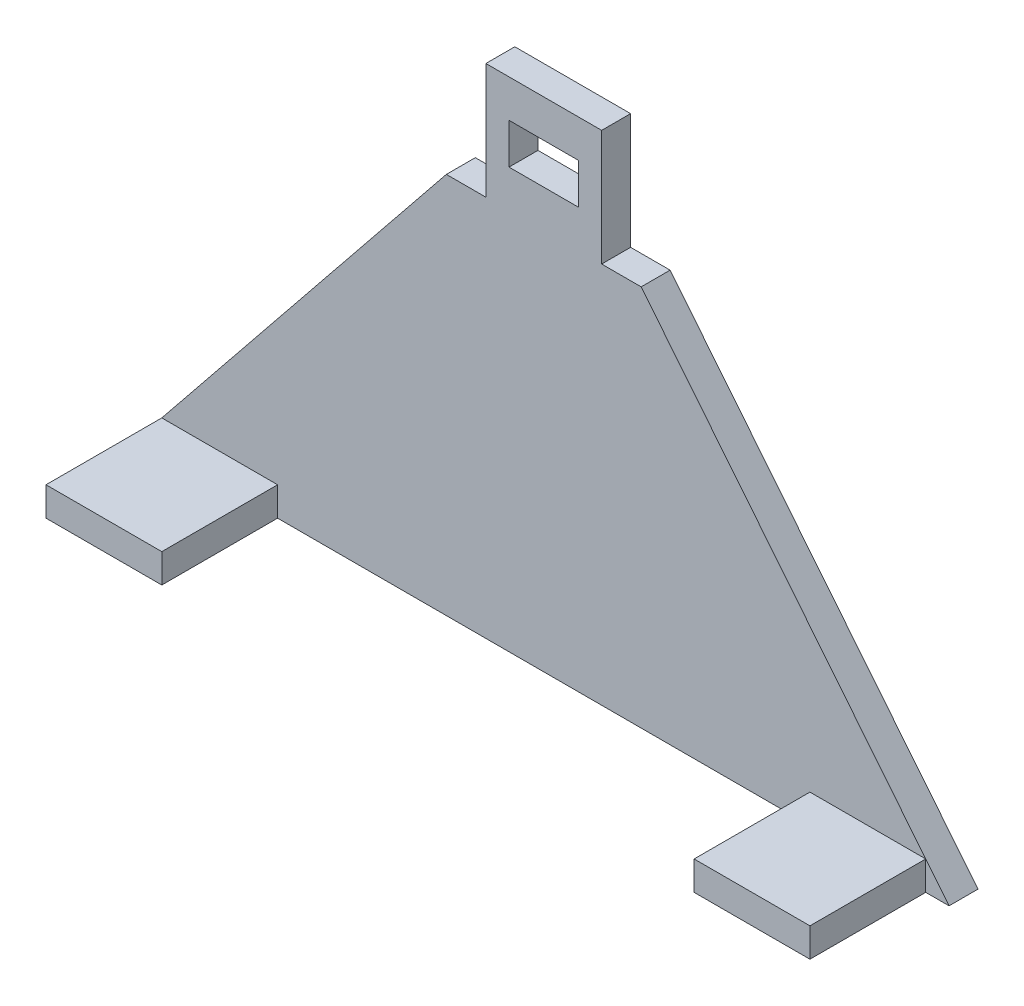
ISO-10303-21;
HEADER;
FILE_DESCRIPTION(('STEP AP214'),'2;1');
FILE_NAME('part.step','',(''),(''),'','','');
FILE_SCHEMA(('AUTOMOTIVE_DESIGN { 1 0 10303 214 1 1 1 1 }'));
ENDSEC;
DATA;
#1=APPLICATION_CONTEXT('core data for automotive mechanical design processes');
#2=APPLICATION_PROTOCOL_DEFINITION('international standard','automotive_design',2000,#1);
#3=PRODUCT_CONTEXT('',#1,'mechanical');
#4=PRODUCT('Part','Part','',(#3));
#5=PRODUCT_RELATED_PRODUCT_CATEGORY('part','',(#4));
#6=PRODUCT_DEFINITION_FORMATION('','',#4);
#7=PRODUCT_DEFINITION_CONTEXT('part definition',#1,'design');
#8=PRODUCT_DEFINITION('design','',#6,#7);
#9=PRODUCT_DEFINITION_SHAPE('','',#8);
#10=(LENGTH_UNIT() NAMED_UNIT(*) SI_UNIT(.MILLI.,.METRE.));
#11=(NAMED_UNIT(*) PLANE_ANGLE_UNIT() SI_UNIT($,.RADIAN.));
#12=(NAMED_UNIT(*) SI_UNIT($,.STERADIAN.) SOLID_ANGLE_UNIT());
#13=UNCERTAINTY_MEASURE_WITH_UNIT(LENGTH_MEASURE(1.E-05),#10,'distance_accuracy_value','');
#14=(GEOMETRIC_REPRESENTATION_CONTEXT(3) GLOBAL_UNCERTAINTY_ASSIGNED_CONTEXT((#13)) GLOBAL_UNIT_ASSIGNED_CONTEXT((#10,
#11,#12)) REPRESENTATION_CONTEXT('',''));
#15=CARTESIAN_POINT('',(0.,0.,0.));
#16=DIRECTION('',(0.,0.,1.));
#17=DIRECTION('',(1.,0.,0.));
#18=AXIS2_PLACEMENT_3D('',#15,#16,#17);
#19=CARTESIAN_POINT('',(0.,0.,0.));
#20=DIRECTION('',(0.,0.,-1.));
#21=DIRECTION('',(-1.,0.,0.));
#22=AXIS2_PLACEMENT_3D('',#19,#20,#21);
#23=PLANE('',#22);
#24=DIRECTION('',(-0.627396072560664,0.778700307008707,0.));
#25=VECTOR('',#24,1.);
#26=CARTESIAN_POINT('',(35.,0.,0.));
#27=LINE('',#26,#25);
#28=CARTESIAN_POINT('',(35.,0.,0.));
#29=VERTEX_POINT('',#28);
#30=CARTESIAN_POINT('',(32.9857588763168,2.5,0.));
#31=VERTEX_POINT('',#30);
#32=EDGE_CURVE('E279',#29,#31,#27,.T.);
#33=ORIENTED_EDGE('',*,*,#32,.T.);
#34=DIRECTION('',(0.,-1.,0.));
#35=VECTOR('',#34,1.);
#36=CARTESIAN_POINT('',(32.9857588763168,2.5,0.));
#37=LINE('',#36,#35);
#38=CARTESIAN_POINT('',(32.9857588763168,0.,0.));
#39=VERTEX_POINT('',#38);
#40=EDGE_CURVE('E183',#31,#39,#37,.T.);
#41=ORIENTED_EDGE('',*,*,#40,.T.);
#42=DIRECTION('',(1.,0.,0.));
#43=VECTOR('',#42,1.);
#44=CARTESIAN_POINT('',(-35.,0.,0.));
#45=LINE('',#44,#43);
#46=EDGE_CURVE('E318',#39,#29,#45,.T.);
#47=ORIENTED_EDGE('',*,*,#46,.T.);
#48=EDGE_LOOP('',(#33,#41,#47));
#49=FACE_BOUND('',#48,.T.);
#50=ADVANCED_FACE('F37',(#49),#23,.F.);
#51=DIRECTION('',(0.,-1.,0.));
#52=VECTOR('',#51,1.);
#53=CARTESIAN_POINT('',(-32.9857588763168,2.5,0.));
#54=LINE('',#53,#52);
#55=CARTESIAN_POINT('',(-32.9857588763168,2.5,0.));
#56=VERTEX_POINT('',#55);
#57=CARTESIAN_POINT('',(-32.9857588763168,0.,0.));
#58=VERTEX_POINT('',#57);
#59=EDGE_CURVE('E186',#56,#58,#54,.T.);
#60=ORIENTED_EDGE('',*,*,#59,.F.);
#61=DIRECTION('',(-0.627396072560664,-0.778700307008707,0.));
#62=VECTOR('',#61,1.);
#63=CARTESIAN_POINT('',(-8.41201716738196,33.,0.));
#64=LINE('',#63,#62);
#65=CARTESIAN_POINT('',(-35.,0.,0.));
#66=VERTEX_POINT('',#65);
#67=EDGE_CURVE('E314',#56,#66,#64,.T.);
#68=ORIENTED_EDGE('',*,*,#67,.T.);
#69=EDGE_CURVE('E319',#66,#58,#45,.T.);
#70=ORIENTED_EDGE('',*,*,#69,.T.);
#71=EDGE_LOOP('',(#60,#68,#70));
#72=FACE_BOUND('',#71,.T.);
#73=ADVANCED_FACE('F389',(#72),#23,.F.);
#74=DIRECTION('',(1.,0.,0.));
#75=VECTOR('',#74,1.);
#76=CARTESIAN_POINT('',(-3.,36.25,0.));
#77=LINE('',#76,#75);
#78=CARTESIAN_POINT('',(-3.,36.25,0.));
#79=VERTEX_POINT('',#78);
#80=CARTESIAN_POINT('',(3.,36.25,0.));
#81=VERTEX_POINT('',#80);
#82=EDGE_CURVE('E258',#79,#81,#77,.T.);
#83=ORIENTED_EDGE('',*,*,#82,.F.);
#84=DIRECTION('',(0.,-1.,0.));
#85=VECTOR('',#84,1.);
#86=CARTESIAN_POINT('',(-3.,39.75,0.));
#87=LINE('',#86,#85);
#88=CARTESIAN_POINT('',(-3.,39.75,0.));
#89=VERTEX_POINT('',#88);
#90=EDGE_CURVE('E242',#89,#79,#87,.T.);
#91=ORIENTED_EDGE('',*,*,#90,.F.);
#92=DIRECTION('',(-1.,0.,0.));
#93=VECTOR('',#92,1.);
#94=CARTESIAN_POINT('',(-3.,39.75,0.));
#95=LINE('',#94,#93);
#96=CARTESIAN_POINT('',(3.,39.75,0.));
#97=VERTEX_POINT('',#96);
#98=EDGE_CURVE('E247',#97,#89,#95,.T.);
#99=ORIENTED_EDGE('',*,*,#98,.F.);
#100=DIRECTION('',(0.,1.,0.));
#101=VECTOR('',#100,1.);
#102=CARTESIAN_POINT('',(3.,39.75,0.));
#103=LINE('',#102,#101);
#104=EDGE_CURVE('E261',#81,#97,#103,.T.);
#105=ORIENTED_EDGE('',*,*,#104,.F.);
#106=EDGE_LOOP('',(#83,#91,#99,#105));
#107=FACE_BOUND('',#106,.T.);
#108=DIRECTION('',(0.,1.,0.));
#109=VECTOR('',#108,1.);
#110=CARTESIAN_POINT('',(22.9857588763168,2.5,0.));
#111=LINE('',#110,#109);
#112=CARTESIAN_POINT('',(22.9857588763168,0.,0.));
#113=VERTEX_POINT('',#112);
#114=CARTESIAN_POINT('',(22.9857588763168,2.5,0.));
#115=VERTEX_POINT('',#114);
#116=EDGE_CURVE('E54',#113,#115,#111,.T.);
#117=ORIENTED_EDGE('',*,*,#116,.T.);
#118=DIRECTION('',(1.,0.,0.));
#119=VECTOR('',#118,1.);
#120=CARTESIAN_POINT('',(32.9857588763168,2.5,0.));
#121=LINE('',#120,#119);
#122=EDGE_CURVE('E59',#115,#31,#121,.T.);
#123=ORIENTED_EDGE('',*,*,#122,.T.);
#124=CARTESIAN_POINT('',(8.41201716738196,33.,0.));
#125=VERTEX_POINT('',#124);
#126=EDGE_CURVE('E321',#31,#125,#27,.T.);
#127=ORIENTED_EDGE('',*,*,#126,.T.);
#128=DIRECTION('',(-1.,0.,0.));
#129=VECTOR('',#128,1.);
#130=CARTESIAN_POINT('',(8.41201716738196,33.,0.));
#131=LINE('',#130,#129);
#132=CARTESIAN_POINT('',(5.,33.,0.));
#133=VERTEX_POINT('',#132);
#134=EDGE_CURVE('E268',#125,#133,#131,.T.);
#135=ORIENTED_EDGE('',*,*,#134,.T.);
#136=DIRECTION('',(0.,1.,0.));
#137=VECTOR('',#136,1.);
#138=CARTESIAN_POINT('',(5.,33.,0.));
#139=LINE('',#138,#137);
#140=CARTESIAN_POINT('',(5.,43.,0.));
#141=VERTEX_POINT('',#140);
#142=EDGE_CURVE('E302',#133,#141,#139,.T.);
#143=ORIENTED_EDGE('',*,*,#142,.T.);
#144=DIRECTION('',(-1.,0.,0.));
#145=VECTOR('',#144,1.);
#146=CARTESIAN_POINT('',(5.,43.,0.));
#147=LINE('',#146,#145);
#148=CARTESIAN_POINT('',(-5.,43.,0.));
#149=VERTEX_POINT('',#148);
#150=EDGE_CURVE('E305',#141,#149,#147,.T.);
#151=ORIENTED_EDGE('',*,*,#150,.T.);
#152=DIRECTION('',(0.,-1.,0.));
#153=VECTOR('',#152,1.);
#154=CARTESIAN_POINT('',(-5.,43.,0.));
#155=LINE('',#154,#153);
#156=CARTESIAN_POINT('',(-5.,33.,0.));
#157=VERTEX_POINT('',#156);
#158=EDGE_CURVE('E308',#149,#157,#155,.T.);
#159=ORIENTED_EDGE('',*,*,#158,.T.);
#160=DIRECTION('',(-1.,0.,0.));
#161=VECTOR('',#160,1.);
#162=CARTESIAN_POINT('',(-5.,33.,0.));
#163=LINE('',#162,#161);
#164=CARTESIAN_POINT('',(-8.41201716738196,33.,0.));
#165=VERTEX_POINT('',#164);
#166=EDGE_CURVE('E311',#157,#165,#163,.T.);
#167=ORIENTED_EDGE('',*,*,#166,.T.);
#168=EDGE_CURVE('E315',#165,#56,#64,.T.);
#169=ORIENTED_EDGE('',*,*,#168,.T.);
#170=DIRECTION('',(-1.,0.,0.));
#171=VECTOR('',#170,1.);
#172=CARTESIAN_POINT('',(-32.9857588763168,2.5,0.));
#173=LINE('',#172,#171);
#174=CARTESIAN_POINT('',(-22.9857588763168,2.5,0.));
#175=VERTEX_POINT('',#174);
#176=EDGE_CURVE('E217',#175,#56,#173,.T.);
#177=ORIENTED_EDGE('',*,*,#176,.F.);
#178=DIRECTION('',(0.,1.,0.));
#179=VECTOR('',#178,1.);
#180=CARTESIAN_POINT('',(-22.9857588763168,2.5,0.));
#181=LINE('',#180,#179);
#182=CARTESIAN_POINT('',(-22.9857588763168,0.,0.));
#183=VERTEX_POINT('',#182);
#184=EDGE_CURVE('E226',#183,#175,#181,.T.);
#185=ORIENTED_EDGE('',*,*,#184,.F.);
#186=EDGE_CURVE('E322',#183,#113,#45,.T.);
#187=ORIENTED_EDGE('',*,*,#186,.T.);
#188=EDGE_LOOP('',(#117,#123,#127,#135,#143,#151,#159,#167,#169,#177,#185,#187));
#189=FACE_BOUND('',#188,.T.);
#190=ADVANCED_FACE('F344',(#107,#189),#23,.F.);
#191=CARTESIAN_POINT('',(8.41201716738196,33.,-2.5));
#192=DIRECTION('',(0.,1.,0.));
#193=DIRECTION('',(0.,0.,1.));
#194=AXIS2_PLACEMENT_3D('',#191,#192,#193);
#195=PLANE('',#194);
#196=ORIENTED_EDGE('',*,*,#134,.F.);
#197=DIRECTION('',(0.,0.,1.));
#198=VECTOR('',#197,1.);
#199=CARTESIAN_POINT('',(8.41201716738196,33.,-2.5));
#200=LINE('',#199,#198);
#201=CARTESIAN_POINT('',(8.41201716738196,33.,-2.5));
#202=VERTEX_POINT('',#201);
#203=EDGE_CURVE('E11',#202,#125,#200,.T.);
#204=ORIENTED_EDGE('',*,*,#203,.F.);
#205=DIRECTION('',(-1.,0.,0.));
#206=VECTOR('',#205,1.);
#207=CARTESIAN_POINT('',(8.41201716738196,33.,-2.5));
#208=LINE('',#207,#206);
#209=CARTESIAN_POINT('',(5.,33.,-2.5));
#210=VERTEX_POINT('',#209);
#211=EDGE_CURVE('E275',#202,#210,#208,.T.);
#212=ORIENTED_EDGE('',*,*,#211,.T.);
#213=DIRECTION('',(0.,0.,1.));
#214=VECTOR('',#213,1.);
#215=CARTESIAN_POINT('',(5.,33.,-2.5));
#216=LINE('',#215,#214);
#217=EDGE_CURVE('E41',#210,#133,#216,.T.);
#218=ORIENTED_EDGE('',*,*,#217,.T.);
#219=EDGE_LOOP('',(#196,#204,#212,#218));
#220=FACE_BOUND('',#219,.T.);
#221=ADVANCED_FACE('F39',(#220),#195,.T.);
#222=CARTESIAN_POINT('',(35.,0.,-2.5));
#223=DIRECTION('',(0.778700307008707,0.627396072560664,0.));
#224=DIRECTION('',(-0.627396072560664,0.778700307008707,0.));
#225=AXIS2_PLACEMENT_3D('',#222,#223,#224);
#226=PLANE('',#225);
#227=ORIENTED_EDGE('',*,*,#32,.F.);
#228=DIRECTION('',(0.,0.,1.));
#229=VECTOR('',#228,1.);
#230=CARTESIAN_POINT('',(35.,0.,-2.5));
#231=LINE('',#230,#229);
#232=CARTESIAN_POINT('',(35.,0.,-2.5));
#233=VERTEX_POINT('',#232);
#234=EDGE_CURVE('E46',#233,#29,#231,.T.);
#235=ORIENTED_EDGE('',*,*,#234,.F.);
#236=DIRECTION('',(-0.627396072560664,0.778700307008707,0.));
#237=VECTOR('',#236,1.);
#238=CARTESIAN_POINT('',(35.,0.,-2.5));
#239=LINE('',#238,#237);
#240=EDGE_CURVE('E297',#233,#202,#239,.T.);
#241=ORIENTED_EDGE('',*,*,#240,.T.);
#242=ORIENTED_EDGE('',*,*,#203,.T.);
#243=ORIENTED_EDGE('',*,*,#126,.F.);
#244=EDGE_LOOP('',(#227,#235,#241,#242,#243));
#245=FACE_BOUND('',#244,.T.);
#246=ADVANCED_FACE('F347',(#245),#226,.T.);
#247=CARTESIAN_POINT('',(-35.,0.,-2.5));
#248=DIRECTION('',(0.,-1.,0.));
#249=DIRECTION('',(0.,0.,-1.));
#250=AXIS2_PLACEMENT_3D('',#247,#248,#249);
#251=PLANE('',#250);
#252=ORIENTED_EDGE('',*,*,#69,.F.);
#253=DIRECTION('',(0.,0.,1.));
#254=VECTOR('',#253,1.);
#255=CARTESIAN_POINT('',(-35.,0.,-2.5));
#256=LINE('',#255,#254);
#257=CARTESIAN_POINT('',(-35.,0.,-2.5));
#258=VERTEX_POINT('',#257);
#259=EDGE_CURVE('E327',#258,#66,#256,.T.);
#260=ORIENTED_EDGE('',*,*,#259,.F.);
#261=DIRECTION('',(1.,0.,0.));
#262=VECTOR('',#261,1.);
#263=CARTESIAN_POINT('',(-35.,0.,-2.5));
#264=LINE('',#263,#262);
#265=EDGE_CURVE('E294',#258,#233,#264,.T.);
#266=ORIENTED_EDGE('',*,*,#265,.T.);
#267=ORIENTED_EDGE('',*,*,#234,.T.);
#268=ORIENTED_EDGE('',*,*,#46,.F.);
#269=DIRECTION('',(0.,0.,-1.));
#270=VECTOR('',#269,1.);
#271=CARTESIAN_POINT('',(32.9857588763168,0.,10.));
#272=LINE('',#271,#270);
#273=CARTESIAN_POINT('',(32.9857588763168,0.,10.));
#274=VERTEX_POINT('',#273);
#275=EDGE_CURVE('E204',#274,#39,#272,.T.);
#276=ORIENTED_EDGE('',*,*,#275,.F.);
#277=DIRECTION('',(-1.,0.,0.));
#278=VECTOR('',#277,1.);
#279=CARTESIAN_POINT('',(32.9857588763168,0.,10.));
#280=LINE('',#279,#278);
#281=CARTESIAN_POINT('',(22.9857588763168,0.,10.));
#282=VERTEX_POINT('',#281);
#283=EDGE_CURVE('E196',#274,#282,#280,.T.);
#284=ORIENTED_EDGE('',*,*,#283,.T.);
#285=DIRECTION('',(0.,0.,-1.));
#286=VECTOR('',#285,1.);
#287=CARTESIAN_POINT('',(22.9857588763168,0.,10.));
#288=LINE('',#287,#286);
#289=EDGE_CURVE('E209',#282,#113,#288,.T.);
#290=ORIENTED_EDGE('',*,*,#289,.T.);
#291=ORIENTED_EDGE('',*,*,#186,.F.);
#292=DIRECTION('',(0.,0.,-1.));
#293=VECTOR('',#292,1.);
#294=CARTESIAN_POINT('',(-22.9857588763168,0.,10.));
#295=LINE('',#294,#293);
#296=CARTESIAN_POINT('',(-22.9857588763168,0.,10.));
#297=VERTEX_POINT('',#296);
#298=EDGE_CURVE('E236',#297,#183,#295,.T.);
#299=ORIENTED_EDGE('',*,*,#298,.F.);
#300=DIRECTION('',(1.,0.,0.));
#301=VECTOR('',#300,1.);
#302=CARTESIAN_POINT('',(-32.9857588763168,0.,10.));
#303=LINE('',#302,#301);
#304=CARTESIAN_POINT('',(-32.9857588763168,0.,10.));
#305=VERTEX_POINT('',#304);
#306=EDGE_CURVE('E216',#305,#297,#303,.T.);
#307=ORIENTED_EDGE('',*,*,#306,.F.);
#308=DIRECTION('',(0.,0.,-1.));
#309=VECTOR('',#308,1.);
#310=CARTESIAN_POINT('',(-32.9857588763168,0.,10.));
#311=LINE('',#310,#309);
#312=EDGE_CURVE('E239',#305,#58,#311,.T.);
#313=ORIENTED_EDGE('',*,*,#312,.T.);
#314=EDGE_LOOP('',(#252,#260,#266,#267,#268,#276,#284,#290,#291,#299,#307,#313));
#315=FACE_BOUND('',#314,.T.);
#316=ADVANCED_FACE('F386',(#315),#251,.T.);
#317=CARTESIAN_POINT('',(-8.41201716738196,33.,-2.5));
#318=DIRECTION('',(-0.778700307008707,0.627396072560664,0.));
#319=DIRECTION('',(-0.627396072560664,-0.778700307008707,0.));
#320=AXIS2_PLACEMENT_3D('',#317,#318,#319);
#321=PLANE('',#320);
#322=ORIENTED_EDGE('',*,*,#168,.F.);
#323=DIRECTION('',(0.,0.,1.));
#324=VECTOR('',#323,1.);
#325=CARTESIAN_POINT('',(-8.41201716738196,33.,-2.5));
#326=LINE('',#325,#324);
#327=CARTESIAN_POINT('',(-8.41201716738196,33.,-2.5));
#328=VERTEX_POINT('',#327);
#329=EDGE_CURVE('E330',#328,#165,#326,.T.);
#330=ORIENTED_EDGE('',*,*,#329,.F.);
#331=DIRECTION('',(-0.627396072560664,-0.778700307008707,0.));
#332=VECTOR('',#331,1.);
#333=CARTESIAN_POINT('',(-8.41201716738196,33.,-2.5));
#334=LINE('',#333,#332);
#335=EDGE_CURVE('E291',#328,#258,#334,.T.);
#336=ORIENTED_EDGE('',*,*,#335,.T.);
#337=ORIENTED_EDGE('',*,*,#259,.T.);
#338=ORIENTED_EDGE('',*,*,#67,.F.);
#339=EDGE_LOOP('',(#322,#330,#336,#337,#338));
#340=FACE_BOUND('',#339,.T.);
#341=ADVANCED_FACE('F367',(#340),#321,.T.);
#342=CARTESIAN_POINT('',(-5.,33.,-2.5));
#343=DIRECTION('',(0.,1.,0.));
#344=DIRECTION('',(0.,0.,1.));
#345=AXIS2_PLACEMENT_3D('',#342,#343,#344);
#346=PLANE('',#345);
#347=ORIENTED_EDGE('',*,*,#166,.F.);
#348=DIRECTION('',(0.,0.,1.));
#349=VECTOR('',#348,1.);
#350=CARTESIAN_POINT('',(-5.,33.,-2.5));
#351=LINE('',#350,#349);
#352=CARTESIAN_POINT('',(-5.,33.,-2.5));
#353=VERTEX_POINT('',#352);
#354=EDGE_CURVE('E332',#353,#157,#351,.T.);
#355=ORIENTED_EDGE('',*,*,#354,.F.);
#356=DIRECTION('',(-1.,0.,0.));
#357=VECTOR('',#356,1.);
#358=CARTESIAN_POINT('',(-5.,33.,-2.5));
#359=LINE('',#358,#357);
#360=EDGE_CURVE('E288',#353,#328,#359,.T.);
#361=ORIENTED_EDGE('',*,*,#360,.T.);
#362=ORIENTED_EDGE('',*,*,#329,.T.);
#363=EDGE_LOOP('',(#347,#355,#361,#362));
#364=FACE_BOUND('',#363,.T.);
#365=ADVANCED_FACE('F362',(#364),#346,.T.);
#366=CARTESIAN_POINT('',(-5.,43.,-2.5));
#367=DIRECTION('',(-1.,0.,0.));
#368=DIRECTION('',(0.,0.,1.));
#369=AXIS2_PLACEMENT_3D('',#366,#367,#368);
#370=PLANE('',#369);
#371=ORIENTED_EDGE('',*,*,#158,.F.);
#372=DIRECTION('',(0.,0.,1.));
#373=VECTOR('',#372,1.);
#374=CARTESIAN_POINT('',(-5.,43.,-2.5));
#375=LINE('',#374,#373);
#376=CARTESIAN_POINT('',(-5.,43.,-2.5));
#377=VERTEX_POINT('',#376);
#378=EDGE_CURVE('E334',#377,#149,#375,.T.);
#379=ORIENTED_EDGE('',*,*,#378,.F.);
#380=DIRECTION('',(0.,-1.,0.));
#381=VECTOR('',#380,1.);
#382=CARTESIAN_POINT('',(-5.,43.,-2.5));
#383=LINE('',#382,#381);
#384=EDGE_CURVE('E285',#377,#353,#383,.T.);
#385=ORIENTED_EDGE('',*,*,#384,.T.);
#386=ORIENTED_EDGE('',*,*,#354,.T.);
#387=EDGE_LOOP('',(#371,#379,#385,#386));
#388=FACE_BOUND('',#387,.T.);
#389=ADVANCED_FACE('F360',(#388),#370,.T.);
#390=CARTESIAN_POINT('',(5.,43.,-2.5));
#391=DIRECTION('',(0.,1.,0.));
#392=DIRECTION('',(0.,0.,1.));
#393=AXIS2_PLACEMENT_3D('',#390,#391,#392);
#394=PLANE('',#393);
#395=ORIENTED_EDGE('',*,*,#150,.F.);
#396=DIRECTION('',(0.,0.,1.));
#397=VECTOR('',#396,1.);
#398=CARTESIAN_POINT('',(5.,43.,-2.5));
#399=LINE('',#398,#397);
#400=CARTESIAN_POINT('',(5.,43.,-2.5));
#401=VERTEX_POINT('',#400);
#402=EDGE_CURVE('E335',#401,#141,#399,.T.);
#403=ORIENTED_EDGE('',*,*,#402,.F.);
#404=DIRECTION('',(-1.,0.,0.));
#405=VECTOR('',#404,1.);
#406=CARTESIAN_POINT('',(5.,43.,-2.5));
#407=LINE('',#406,#405);
#408=EDGE_CURVE('E282',#401,#377,#407,.T.);
#409=ORIENTED_EDGE('',*,*,#408,.T.);
#410=ORIENTED_EDGE('',*,*,#378,.T.);
#411=EDGE_LOOP('',(#395,#403,#409,#410));
#412=FACE_BOUND('',#411,.T.);
#413=ADVANCED_FACE('F356',(#412),#394,.T.);
#414=CARTESIAN_POINT('',(5.,33.,-2.5));
#415=DIRECTION('',(1.,0.,0.));
#416=DIRECTION('',(0.,0.,-1.));
#417=AXIS2_PLACEMENT_3D('',#414,#415,#416);
#418=PLANE('',#417);
#419=ORIENTED_EDGE('',*,*,#142,.F.);
#420=ORIENTED_EDGE('',*,*,#217,.F.);
#421=DIRECTION('',(0.,1.,0.));
#422=VECTOR('',#421,1.);
#423=CARTESIAN_POINT('',(5.,33.,-2.5));
#424=LINE('',#423,#422);
#425=EDGE_CURVE('E278',#210,#401,#424,.T.);
#426=ORIENTED_EDGE('',*,*,#425,.T.);
#427=ORIENTED_EDGE('',*,*,#402,.T.);
#428=EDGE_LOOP('',(#419,#420,#426,#427));
#429=FACE_BOUND('',#428,.T.);
#430=ADVANCED_FACE('F343',(#429),#418,.T.);
#431=CARTESIAN_POINT('',(0.,0.,-2.5));
#432=DIRECTION('',(0.,0.,-1.));
#433=DIRECTION('',(-1.,0.,0.));
#434=AXIS2_PLACEMENT_3D('',#431,#432,#433);
#435=PLANE('',#434);
#436=DIRECTION('',(0.,-1.,0.));
#437=VECTOR('',#436,1.);
#438=CARTESIAN_POINT('',(-3.,39.75,-2.5));
#439=LINE('',#438,#437);
#440=CARTESIAN_POINT('',(-3.,39.75,-2.5));
#441=VERTEX_POINT('',#440);
#442=CARTESIAN_POINT('',(-3.,36.25,-2.5));
#443=VERTEX_POINT('',#442);
#444=EDGE_CURVE('E243',#441,#443,#439,.T.);
#445=ORIENTED_EDGE('',*,*,#444,.T.);
#446=DIRECTION('',(1.,0.,0.));
#447=VECTOR('',#446,1.);
#448=CARTESIAN_POINT('',(-3.,36.25,-2.5));
#449=LINE('',#448,#447);
#450=CARTESIAN_POINT('',(3.,36.25,-2.5));
#451=VERTEX_POINT('',#450);
#452=EDGE_CURVE('E246',#443,#451,#449,.T.);
#453=ORIENTED_EDGE('',*,*,#452,.T.);
#454=DIRECTION('',(0.,1.,0.));
#455=VECTOR('',#454,1.);
#456=CARTESIAN_POINT('',(3.,39.75,-2.5));
#457=LINE('',#456,#455);
#458=CARTESIAN_POINT('',(3.,39.75,-2.5));
#459=VERTEX_POINT('',#458);
#460=EDGE_CURVE('E250',#451,#459,#457,.T.);
#461=ORIENTED_EDGE('',*,*,#460,.T.);
#462=DIRECTION('',(-1.,0.,0.));
#463=VECTOR('',#462,1.);
#464=CARTESIAN_POINT('',(-3.,39.75,-2.5));
#465=LINE('',#464,#463);
#466=EDGE_CURVE('E253',#459,#441,#465,.T.);
#467=ORIENTED_EDGE('',*,*,#466,.T.);
#468=EDGE_LOOP('',(#445,#453,#461,#467));
#469=FACE_BOUND('',#468,.T.);
#470=ORIENTED_EDGE('',*,*,#211,.F.);
#471=ORIENTED_EDGE('',*,*,#240,.F.);
#472=ORIENTED_EDGE('',*,*,#265,.F.);
#473=ORIENTED_EDGE('',*,*,#335,.F.);
#474=ORIENTED_EDGE('',*,*,#360,.F.);
#475=ORIENTED_EDGE('',*,*,#384,.F.);
#476=ORIENTED_EDGE('',*,*,#408,.F.);
#477=ORIENTED_EDGE('',*,*,#425,.F.);
#478=EDGE_LOOP('',(#470,#471,#472,#473,#474,#475,#476,#477));
#479=FACE_BOUND('',#478,.T.);
#480=ADVANCED_FACE('F350',(#469,#479),#435,.T.);
#481=CARTESIAN_POINT('',(-3.,39.75,-2.5));
#482=DIRECTION('',(-1.,0.,0.));
#483=DIRECTION('',(0.,0.,1.));
#484=AXIS2_PLACEMENT_3D('',#481,#482,#483);
#485=PLANE('',#484);
#486=ORIENTED_EDGE('',*,*,#90,.T.);
#487=DIRECTION('',(0.,0.,1.));
#488=VECTOR('',#487,1.);
#489=CARTESIAN_POINT('',(-3.,36.25,-2.5));
#490=LINE('',#489,#488);
#491=EDGE_CURVE('E256',#443,#79,#490,.T.);
#492=ORIENTED_EDGE('',*,*,#491,.F.);
#493=ORIENTED_EDGE('',*,*,#444,.F.);
#494=DIRECTION('',(0.,0.,1.));
#495=VECTOR('',#494,1.);
#496=CARTESIAN_POINT('',(-3.,39.75,-2.5));
#497=LINE('',#496,#495);
#498=EDGE_CURVE('E266',#441,#89,#497,.T.);
#499=ORIENTED_EDGE('',*,*,#498,.T.);
#500=EDGE_LOOP('',(#486,#492,#493,#499));
#501=FACE_BOUND('',#500,.T.);
#502=ADVANCED_FACE('F415',(#501),#485,.F.);
#503=CARTESIAN_POINT('',(-3.,39.75,-2.5));
#504=DIRECTION('',(0.,1.,0.));
#505=DIRECTION('',(0.,0.,1.));
#506=AXIS2_PLACEMENT_3D('',#503,#504,#505);
#507=PLANE('',#506);
#508=ORIENTED_EDGE('',*,*,#98,.T.);
#509=ORIENTED_EDGE('',*,*,#498,.F.);
#510=ORIENTED_EDGE('',*,*,#466,.F.);
#511=DIRECTION('',(0.,0.,1.));
#512=VECTOR('',#511,1.);
#513=CARTESIAN_POINT('',(3.,39.75,-2.5));
#514=LINE('',#513,#512);
#515=EDGE_CURVE('E269',#459,#97,#514,.T.);
#516=ORIENTED_EDGE('',*,*,#515,.T.);
#517=EDGE_LOOP('',(#508,#509,#510,#516));
#518=FACE_BOUND('',#517,.T.);
#519=ADVANCED_FACE('F420',(#518),#507,.F.);
#520=CARTESIAN_POINT('',(3.,39.75,-2.5));
#521=DIRECTION('',(1.,0.,0.));
#522=DIRECTION('',(0.,0.,-1.));
#523=AXIS2_PLACEMENT_3D('',#520,#521,#522);
#524=PLANE('',#523);
#525=ORIENTED_EDGE('',*,*,#104,.T.);
#526=ORIENTED_EDGE('',*,*,#515,.F.);
#527=ORIENTED_EDGE('',*,*,#460,.F.);
#528=DIRECTION('',(0.,0.,1.));
#529=VECTOR('',#528,1.);
#530=CARTESIAN_POINT('',(3.,36.25,-2.5));
#531=LINE('',#530,#529);
#532=EDGE_CURVE('E271',#451,#81,#531,.T.);
#533=ORIENTED_EDGE('',*,*,#532,.T.);
#534=EDGE_LOOP('',(#525,#526,#527,#533));
#535=FACE_BOUND('',#534,.T.);
#536=ADVANCED_FACE('F432',(#535),#524,.F.);
#537=CARTESIAN_POINT('',(-3.,36.25,-2.5));
#538=DIRECTION('',(0.,-1.,0.));
#539=DIRECTION('',(0.,0.,-1.));
#540=AXIS2_PLACEMENT_3D('',#537,#538,#539);
#541=PLANE('',#540);
#542=ORIENTED_EDGE('',*,*,#82,.T.);
#543=ORIENTED_EDGE('',*,*,#532,.F.);
#544=ORIENTED_EDGE('',*,*,#452,.F.);
#545=ORIENTED_EDGE('',*,*,#491,.T.);
#546=EDGE_LOOP('',(#542,#543,#544,#545));
#547=FACE_BOUND('',#546,.T.);
#548=ADVANCED_FACE('F429',(#547),#541,.F.);
#549=CARTESIAN_POINT('',(-32.9857588763168,2.5,10.));
#550=DIRECTION('',(1.,0.,0.));
#551=DIRECTION('',(0.,0.,-1.));
#552=AXIS2_PLACEMENT_3D('',#549,#550,#551);
#553=PLANE('',#552);
#554=ORIENTED_EDGE('',*,*,#59,.T.);
#555=ORIENTED_EDGE('',*,*,#312,.F.);
#556=DIRECTION('',(0.,-1.,0.));
#557=VECTOR('',#556,1.);
#558=CARTESIAN_POINT('',(-32.9857588763168,2.5,10.));
#559=LINE('',#558,#557);
#560=CARTESIAN_POINT('',(-32.9857588763168,2.5,10.));
#561=VERTEX_POINT('',#560);
#562=EDGE_CURVE('E213',#561,#305,#559,.T.);
#563=ORIENTED_EDGE('',*,*,#562,.F.);
#564=DIRECTION('',(0.,0.,-1.));
#565=VECTOR('',#564,1.);
#566=CARTESIAN_POINT('',(-32.9857588763168,2.5,10.));
#567=LINE('',#566,#565);
#568=EDGE_CURVE('E223',#561,#56,#567,.T.);
#569=ORIENTED_EDGE('',*,*,#568,.T.);
#570=EDGE_LOOP('',(#554,#555,#563,#569));
#571=FACE_BOUND('',#570,.T.);
#572=ADVANCED_FACE('F375',(#571),#553,.F.);
#573=CARTESIAN_POINT('',(-22.9857588763168,2.5,10.));
#574=DIRECTION('',(-1.,0.,0.));
#575=DIRECTION('',(0.,0.,1.));
#576=AXIS2_PLACEMENT_3D('',#573,#574,#575);
#577=PLANE('',#576);
#578=ORIENTED_EDGE('',*,*,#184,.T.);
#579=DIRECTION('',(0.,0.,-1.));
#580=VECTOR('',#579,1.);
#581=CARTESIAN_POINT('',(-22.9857588763168,2.5,10.));
#582=LINE('',#581,#580);
#583=CARTESIAN_POINT('',(-22.9857588763168,2.5,10.));
#584=VERTEX_POINT('',#583);
#585=EDGE_CURVE('E233',#584,#175,#582,.T.);
#586=ORIENTED_EDGE('',*,*,#585,.F.);
#587=DIRECTION('',(0.,1.,0.));
#588=VECTOR('',#587,1.);
#589=CARTESIAN_POINT('',(-22.9857588763168,2.5,10.));
#590=LINE('',#589,#588);
#591=EDGE_CURVE('E219',#297,#584,#590,.T.);
#592=ORIENTED_EDGE('',*,*,#591,.F.);
#593=ORIENTED_EDGE('',*,*,#298,.T.);
#594=EDGE_LOOP('',(#578,#586,#592,#593));
#595=FACE_BOUND('',#594,.T.);
#596=ADVANCED_FACE('F382',(#595),#577,.F.);
#597=CARTESIAN_POINT('',(-32.9857588763168,2.5,10.));
#598=DIRECTION('',(0.,-1.,0.));
#599=DIRECTION('',(0.,0.,-1.));
#600=AXIS2_PLACEMENT_3D('',#597,#598,#599);
#601=PLANE('',#600);
#602=ORIENTED_EDGE('',*,*,#176,.T.);
#603=ORIENTED_EDGE('',*,*,#568,.F.);
#604=DIRECTION('',(-1.,0.,0.));
#605=VECTOR('',#604,1.);
#606=CARTESIAN_POINT('',(-32.9857588763168,2.5,10.));
#607=LINE('',#606,#605);
#608=EDGE_CURVE('E221',#584,#561,#607,.T.);
#609=ORIENTED_EDGE('',*,*,#608,.F.);
#610=ORIENTED_EDGE('',*,*,#585,.T.);
#611=EDGE_LOOP('',(#602,#603,#609,#610));
#612=FACE_BOUND('',#611,.T.);
#613=ADVANCED_FACE('F370',(#612),#601,.F.);
#614=CARTESIAN_POINT('',(0.,0.,10.));
#615=DIRECTION('',(0.,0.,1.));
#616=DIRECTION('',(1.,0.,0.));
#617=AXIS2_PLACEMENT_3D('',#614,#615,#616);
#618=PLANE('',#617);
#619=ORIENTED_EDGE('',*,*,#562,.T.);
#620=ORIENTED_EDGE('',*,*,#306,.T.);
#621=ORIENTED_EDGE('',*,*,#591,.T.);
#622=ORIENTED_EDGE('',*,*,#608,.T.);
#623=EDGE_LOOP('',(#619,#620,#621,#622));
#624=FACE_BOUND('',#623,.T.);
#625=ADVANCED_FACE('F378',(#624),#618,.T.);
#626=CARTESIAN_POINT('',(32.9857588763168,2.5,10.));
#627=DIRECTION('',(1.,0.,0.));
#628=DIRECTION('',(0.,0.,-1.));
#629=AXIS2_PLACEMENT_3D('',#626,#627,#628);
#630=PLANE('',#629);
#631=ORIENTED_EDGE('',*,*,#40,.F.);
#632=DIRECTION('',(0.,0.,-1.));
#633=VECTOR('',#632,1.);
#634=CARTESIAN_POINT('',(32.9857588763168,2.5,10.));
#635=LINE('',#634,#633);
#636=CARTESIAN_POINT('',(32.9857588763168,2.5,10.));
#637=VERTEX_POINT('',#636);
#638=EDGE_CURVE('E176',#637,#31,#635,.T.);
#639=ORIENTED_EDGE('',*,*,#638,.F.);
#640=DIRECTION('',(0.,-1.,0.));
#641=VECTOR('',#640,1.);
#642=CARTESIAN_POINT('',(32.9857588763168,2.5,10.));
#643=LINE('',#642,#641);
#644=EDGE_CURVE('E180',#637,#274,#643,.T.);
#645=ORIENTED_EDGE('',*,*,#644,.T.);
#646=ORIENTED_EDGE('',*,*,#275,.T.);
#647=EDGE_LOOP('',(#631,#639,#645,#646));
#648=FACE_BOUND('',#647,.T.);
#649=ADVANCED_FACE('F178',(#648),#630,.T.);
#650=CARTESIAN_POINT('',(32.9857588763168,2.5,10.));
#651=DIRECTION('',(0.,1.,0.));
#652=DIRECTION('',(0.,0.,1.));
#653=AXIS2_PLACEMENT_3D('',#650,#651,#652);
#654=PLANE('',#653);
#655=ORIENTED_EDGE('',*,*,#122,.F.);
#656=DIRECTION('',(0.,0.,-1.));
#657=VECTOR('',#656,1.);
#658=CARTESIAN_POINT('',(22.9857588763168,2.5,10.));
#659=LINE('',#658,#657);
#660=CARTESIAN_POINT('',(22.9857588763168,2.5,10.));
#661=VERTEX_POINT('',#660);
#662=EDGE_CURVE('E187',#661,#115,#659,.T.);
#663=ORIENTED_EDGE('',*,*,#662,.F.);
#664=DIRECTION('',(1.,0.,0.));
#665=VECTOR('',#664,1.);
#666=CARTESIAN_POINT('',(32.9857588763168,2.5,10.));
#667=LINE('',#666,#665);
#668=EDGE_CURVE('E193',#661,#637,#667,.T.);
#669=ORIENTED_EDGE('',*,*,#668,.T.);
#670=ORIENTED_EDGE('',*,*,#638,.T.);
#671=EDGE_LOOP('',(#655,#663,#669,#670));
#672=FACE_BOUND('',#671,.T.);
#673=ADVANCED_FACE('F198',(#672),#654,.T.);
#674=CARTESIAN_POINT('',(22.9857588763168,2.5,10.));
#675=DIRECTION('',(-1.,0.,0.));
#676=DIRECTION('',(0.,0.,1.));
#677=AXIS2_PLACEMENT_3D('',#674,#675,#676);
#678=PLANE('',#677);
#679=ORIENTED_EDGE('',*,*,#116,.F.);
#680=ORIENTED_EDGE('',*,*,#289,.F.);
#681=DIRECTION('',(0.,1.,0.));
#682=VECTOR('',#681,1.);
#683=CARTESIAN_POINT('',(22.9857588763168,2.5,10.));
#684=LINE('',#683,#682);
#685=EDGE_CURVE('E199',#282,#661,#684,.T.);
#686=ORIENTED_EDGE('',*,*,#685,.T.);
#687=ORIENTED_EDGE('',*,*,#662,.T.);
#688=EDGE_LOOP('',(#679,#680,#686,#687));
#689=FACE_BOUND('',#688,.T.);
#690=ADVANCED_FACE('F462',(#689),#678,.T.);
#691=CARTESIAN_POINT('',(0.,0.,10.));
#692=DIRECTION('',(0.,0.,1.));
#693=DIRECTION('',(-1.,0.,0.));
#694=AXIS2_PLACEMENT_3D('',#691,#692,#693);
#695=PLANE('',#694);
#696=ORIENTED_EDGE('',*,*,#644,.F.);
#697=ORIENTED_EDGE('',*,*,#668,.F.);
#698=ORIENTED_EDGE('',*,*,#685,.F.);
#699=ORIENTED_EDGE('',*,*,#283,.F.);
#700=EDGE_LOOP('',(#696,#697,#698,#699));
#701=FACE_BOUND('',#700,.T.);
#702=ADVANCED_FACE('F191',(#701),#695,.T.);
#703=CLOSED_SHELL('',(#50,#73,#190,#221,#246,#316,#341,#365,#389,#413,#430,#480,#502,#519,#536,
#548,#572,#596,#613,#625,#649,#673,#690,#702));
#704=MANIFOLD_SOLID_BREP('B2',#703);
#705=ADVANCED_BREP_SHAPE_REPRESENTATION('',(#18,#704),#14);
#706=SHAPE_DEFINITION_REPRESENTATION(#9,#705);
ENDSEC;
END-ISO-10303-21;
